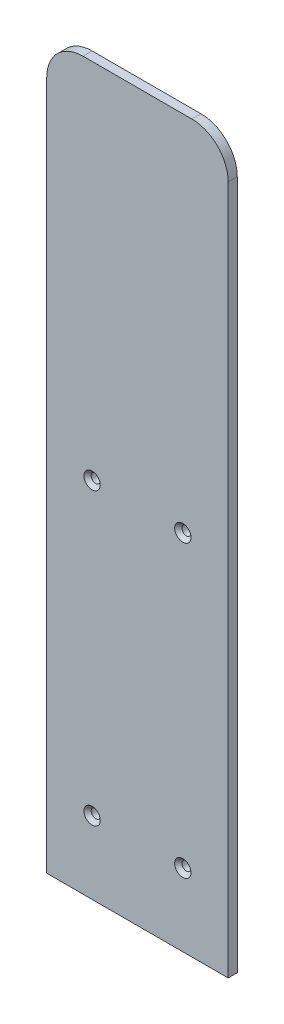
ISO-10303-21;
HEADER;
FILE_DESCRIPTION(('STEP AP214'),'2;1');
FILE_NAME('part.step','',(''),(''),'','','');
FILE_SCHEMA(('AUTOMOTIVE_DESIGN { 1 0 10303 214 1 1 1 1 }'));
ENDSEC;
DATA;
#1=APPLICATION_CONTEXT('core data for automotive mechanical design processes');
#2=APPLICATION_PROTOCOL_DEFINITION('international standard','automotive_design',2000,#1);
#3=PRODUCT_CONTEXT('',#1,'mechanical');
#4=PRODUCT('Part','Part','',(#3));
#5=PRODUCT_RELATED_PRODUCT_CATEGORY('part','',(#4));
#6=PRODUCT_DEFINITION_FORMATION('','',#4);
#7=PRODUCT_DEFINITION_CONTEXT('part definition',#1,'design');
#8=PRODUCT_DEFINITION('design','',#6,#7);
#9=PRODUCT_DEFINITION_SHAPE('','',#8);
#10=(LENGTH_UNIT() NAMED_UNIT(*) SI_UNIT(.MILLI.,.METRE.));
#11=(NAMED_UNIT(*) PLANE_ANGLE_UNIT() SI_UNIT($,.RADIAN.));
#12=(NAMED_UNIT(*) SI_UNIT($,.STERADIAN.) SOLID_ANGLE_UNIT());
#13=UNCERTAINTY_MEASURE_WITH_UNIT(LENGTH_MEASURE(1.E-05),#10,'distance_accuracy_value','');
#14=(GEOMETRIC_REPRESENTATION_CONTEXT(3) GLOBAL_UNCERTAINTY_ASSIGNED_CONTEXT((#13)) GLOBAL_UNIT_ASSIGNED_CONTEXT((#10,
#11,#12)) REPRESENTATION_CONTEXT('',''));
#15=CARTESIAN_POINT('',(0.,0.,0.));
#16=DIRECTION('',(0.,0.,1.));
#17=DIRECTION('',(1.,0.,0.));
#18=AXIS2_PLACEMENT_3D('',#15,#16,#17);
#19=CARTESIAN_POINT('',(31.75,127.,3.175));
#20=DIRECTION('',(-1.,0.,0.));
#21=DIRECTION('',(0.,-1.,0.));
#22=AXIS2_PLACEMENT_3D('',#19,#20,#21);
#23=PLANE('',#22);
#24=DIRECTION('',(0.,1.,0.));
#25=VECTOR('',#24,1.);
#26=CARTESIAN_POINT('',(31.75,127.,0.));
#27=LINE('',#26,#25);
#28=CARTESIAN_POINT('',(31.75,-127.,0.));
#29=VERTEX_POINT('',#28);
#30=CARTESIAN_POINT('',(31.75,114.3,0.));
#31=VERTEX_POINT('',#30);
#32=EDGE_CURVE('E111',#29,#31,#27,.T.);
#33=ORIENTED_EDGE('',*,*,#32,.T.);
#34=DIRECTION('',(0.,0.,-1.));
#35=VECTOR('',#34,1.);
#36=CARTESIAN_POINT('',(31.75,114.3,3.175));
#37=LINE('',#36,#35);
#38=CARTESIAN_POINT('',(31.75,114.3,3.175));
#39=VERTEX_POINT('',#38);
#40=EDGE_CURVE('E55',#31,#39,#37,.F.);
#41=ORIENTED_EDGE('',*,*,#40,.T.);
#42=DIRECTION('',(0.,1.,0.));
#43=VECTOR('',#42,1.);
#44=CARTESIAN_POINT('',(31.75,127.,3.175));
#45=LINE('',#44,#43);
#46=CARTESIAN_POINT('',(31.75,-127.,3.175));
#47=VERTEX_POINT('',#46);
#48=EDGE_CURVE('E119',#47,#39,#45,.T.);
#49=ORIENTED_EDGE('',*,*,#48,.F.);
#50=DIRECTION('',(0.,0.,-1.));
#51=VECTOR('',#50,1.);
#52=CARTESIAN_POINT('',(31.75,-127.,3.175));
#53=LINE('',#52,#51);
#54=EDGE_CURVE('E103',#47,#29,#53,.T.);
#55=ORIENTED_EDGE('',*,*,#54,.T.);
#56=EDGE_LOOP('',(#33,#41,#49,#55));
#57=FACE_BOUND('',#56,.T.);
#58=ADVANCED_FACE('F32',(#57),#23,.F.);
#59=CARTESIAN_POINT('',(-31.75,127.,3.175));
#60=DIRECTION('',(0.,-1.,0.));
#61=DIRECTION('',(0.,0.,-1.));
#62=AXIS2_PLACEMENT_3D('',#59,#60,#61);
#63=PLANE('',#62);
#64=DIRECTION('',(-1.,0.,0.));
#65=VECTOR('',#64,1.);
#66=CARTESIAN_POINT('',(-31.75,127.,3.175));
#67=LINE('',#66,#65);
#68=CARTESIAN_POINT('',(19.05,127.,3.175));
#69=VERTEX_POINT('',#68);
#70=CARTESIAN_POINT('',(-19.05,127.,3.175));
#71=VERTEX_POINT('',#70);
#72=EDGE_CURVE('E93',#69,#71,#67,.T.);
#73=ORIENTED_EDGE('',*,*,#72,.F.);
#74=DIRECTION('',(0.,0.,-1.));
#75=VECTOR('',#74,1.);
#76=CARTESIAN_POINT('',(19.05,127.,3.175));
#77=LINE('',#76,#75);
#78=CARTESIAN_POINT('',(19.05,127.,0.));
#79=VERTEX_POINT('',#78);
#80=EDGE_CURVE('E146',#69,#79,#77,.T.);
#81=ORIENTED_EDGE('',*,*,#80,.T.);
#82=DIRECTION('',(-1.,0.,0.));
#83=VECTOR('',#82,1.);
#84=CARTESIAN_POINT('',(-31.75,127.,0.));
#85=LINE('',#84,#83);
#86=CARTESIAN_POINT('',(-19.05,127.,0.));
#87=VERTEX_POINT('',#86);
#88=EDGE_CURVE('E113',#79,#87,#85,.T.);
#89=ORIENTED_EDGE('',*,*,#88,.T.);
#90=DIRECTION('',(0.,0.,-1.));
#91=VECTOR('',#90,1.);
#92=CARTESIAN_POINT('',(-19.05,127.,3.175));
#93=LINE('',#92,#91);
#94=EDGE_CURVE('E144',#87,#71,#93,.F.);
#95=ORIENTED_EDGE('',*,*,#94,.T.);
#96=EDGE_LOOP('',(#73,#81,#89,#95));
#97=FACE_BOUND('',#96,.T.);
#98=ADVANCED_FACE('F159',(#97),#63,.F.);
#99=CARTESIAN_POINT('',(-31.75,127.,3.175));
#100=DIRECTION('',(1.,0.,0.));
#101=DIRECTION('',(0.,1.,0.));
#102=AXIS2_PLACEMENT_3D('',#99,#100,#101);
#103=PLANE('',#102);
#104=DIRECTION('',(0.,-1.,0.));
#105=VECTOR('',#104,1.);
#106=CARTESIAN_POINT('',(-31.75,127.,3.175));
#107=LINE('',#106,#105);
#108=CARTESIAN_POINT('',(-31.75,114.3,3.175));
#109=VERTEX_POINT('',#108);
#110=CARTESIAN_POINT('',(-31.75,-127.,3.175));
#111=VERTEX_POINT('',#110);
#112=EDGE_CURVE('E85',#109,#111,#107,.T.);
#113=ORIENTED_EDGE('',*,*,#112,.F.);
#114=DIRECTION('',(0.,0.,-1.));
#115=VECTOR('',#114,1.);
#116=CARTESIAN_POINT('',(-31.75,114.3,3.175));
#117=LINE('',#116,#115);
#118=CARTESIAN_POINT('',(-31.75,114.3,0.));
#119=VERTEX_POINT('',#118);
#120=EDGE_CURVE('E11',#109,#119,#117,.T.);
#121=ORIENTED_EDGE('',*,*,#120,.T.);
#122=DIRECTION('',(0.,-1.,0.));
#123=VECTOR('',#122,1.);
#124=CARTESIAN_POINT('',(-31.75,127.,0.));
#125=LINE('',#124,#123);
#126=CARTESIAN_POINT('',(-31.75,-127.,0.));
#127=VERTEX_POINT('',#126);
#128=EDGE_CURVE('E99',#119,#127,#125,.T.);
#129=ORIENTED_EDGE('',*,*,#128,.T.);
#130=DIRECTION('',(0.,0.,-1.));
#131=VECTOR('',#130,1.);
#132=CARTESIAN_POINT('',(-31.75,-127.,3.175));
#133=LINE('',#132,#131);
#134=EDGE_CURVE('E96',#111,#127,#133,.T.);
#135=ORIENTED_EDGE('',*,*,#134,.F.);
#136=EDGE_LOOP('',(#113,#121,#129,#135));
#137=FACE_BOUND('',#136,.T.);
#138=ADVANCED_FACE('F97',(#137),#103,.F.);
#139=CARTESIAN_POINT('',(-31.75,-127.,3.175));
#140=DIRECTION('',(0.,1.,0.));
#141=DIRECTION('',(0.,0.,1.));
#142=AXIS2_PLACEMENT_3D('',#139,#140,#141);
#143=PLANE('',#142);
#144=DIRECTION('',(1.,0.,0.));
#145=VECTOR('',#144,1.);
#146=CARTESIAN_POINT('',(-31.75,-127.,0.));
#147=LINE('',#146,#145);
#148=EDGE_CURVE('E118',#127,#29,#147,.T.);
#149=ORIENTED_EDGE('',*,*,#148,.T.);
#150=ORIENTED_EDGE('',*,*,#54,.F.);
#151=DIRECTION('',(1.,0.,0.));
#152=VECTOR('',#151,1.);
#153=CARTESIAN_POINT('',(-31.75,-127.,3.175));
#154=LINE('',#153,#152);
#155=EDGE_CURVE('E89',#111,#47,#154,.T.);
#156=ORIENTED_EDGE('',*,*,#155,.F.);
#157=ORIENTED_EDGE('',*,*,#134,.T.);
#158=EDGE_LOOP('',(#149,#150,#156,#157));
#159=FACE_BOUND('',#158,.T.);
#160=ADVANCED_FACE('F105',(#159),#143,.F.);
#161=CARTESIAN_POINT('',(0.,0.,3.175));
#162=DIRECTION('',(0.,0.,1.));
#163=DIRECTION('',(1.,0.,0.));
#164=AXIS2_PLACEMENT_3D('',#161,#162,#163);
#165=PLANE('',#164);
#166=CARTESIAN_POINT('',(-15.875,-101.6,3.175));
#167=DIRECTION('',(0.,0.,1.));
#168=DIRECTION('',(1.,0.,0.));
#169=AXIS2_PLACEMENT_3D('',#166,#167,#168);
#170=CIRCLE('',#169,2.85750000000004);
#171=CARTESIAN_POINT('',(-13.0174999999999,-101.6,3.175));
#172=VERTEX_POINT('',#171);
#173=EDGE_CURVE('E132',#172,#172,#170,.F.);
#174=ORIENTED_EDGE('',*,*,#173,.T.);
#175=EDGE_LOOP('',(#174));
#176=FACE_BOUND('',#175,.T.);
#177=CARTESIAN_POINT('',(15.875,-101.6,3.175));
#178=DIRECTION('',(0.,0.,1.));
#179=DIRECTION('',(1.,0.,0.));
#180=AXIS2_PLACEMENT_3D('',#177,#178,#179);
#181=CIRCLE('',#180,2.85750000000004);
#182=CARTESIAN_POINT('',(18.7325000000001,-101.6,3.175));
#183=VERTEX_POINT('',#182);
#184=EDGE_CURVE('E129',#183,#183,#181,.F.);
#185=ORIENTED_EDGE('',*,*,#184,.T.);
#186=EDGE_LOOP('',(#185));
#187=FACE_BOUND('',#186,.T.);
#188=CARTESIAN_POINT('',(-15.875,0.,3.175));
#189=DIRECTION('',(0.,0.,1.));
#190=DIRECTION('',(1.,0.,0.));
#191=AXIS2_PLACEMENT_3D('',#188,#189,#190);
#192=CIRCLE('',#191,2.85750000000004);
#193=CARTESIAN_POINT('',(-13.0175,0.,3.175));
#194=VERTEX_POINT('',#193);
#195=EDGE_CURVE('E126',#194,#194,#192,.F.);
#196=ORIENTED_EDGE('',*,*,#195,.T.);
#197=EDGE_LOOP('',(#196));
#198=FACE_BOUND('',#197,.T.);
#199=CARTESIAN_POINT('',(15.875,0.,3.175));
#200=DIRECTION('',(0.,0.,1.));
#201=DIRECTION('',(1.,0.,0.));
#202=AXIS2_PLACEMENT_3D('',#199,#200,#201);
#203=CIRCLE('',#202,2.85750000000004);
#204=CARTESIAN_POINT('',(18.7325,0.,3.175));
#205=VERTEX_POINT('',#204);
#206=EDGE_CURVE('E123',#205,#205,#203,.F.);
#207=ORIENTED_EDGE('',*,*,#206,.T.);
#208=EDGE_LOOP('',(#207));
#209=FACE_BOUND('',#208,.T.);
#210=ORIENTED_EDGE('',*,*,#48,.T.);
#211=CARTESIAN_POINT('',(19.05,114.3,3.175));
#212=DIRECTION('',(0.,0.,1.));
#213=DIRECTION('',(1.,0.,0.));
#214=AXIS2_PLACEMENT_3D('',#211,#212,#213);
#215=CIRCLE('',#214,12.7);
#216=EDGE_CURVE('E40',#39,#69,#215,.T.);
#217=ORIENTED_EDGE('',*,*,#216,.T.);
#218=ORIENTED_EDGE('',*,*,#72,.T.);
#219=CARTESIAN_POINT('',(-19.05,114.3,3.175));
#220=DIRECTION('',(0.,0.,1.));
#221=DIRECTION('',(1.,0.,0.));
#222=AXIS2_PLACEMENT_3D('',#219,#220,#221);
#223=CIRCLE('',#222,12.7);
#224=EDGE_CURVE('E47',#71,#109,#223,.T.);
#225=ORIENTED_EDGE('',*,*,#224,.T.);
#226=ORIENTED_EDGE('',*,*,#112,.T.);
#227=ORIENTED_EDGE('',*,*,#155,.T.);
#228=EDGE_LOOP('',(#210,#217,#218,#225,#226,#227));
#229=FACE_BOUND('',#228,.T.);
#230=ADVANCED_FACE('F87',(#176,#187,#198,#209,#229),#165,.T.);
#231=CARTESIAN_POINT('',(0.,0.,0.));
#232=DIRECTION('',(0.,0.,1.));
#233=DIRECTION('',(1.,0.,0.));
#234=AXIS2_PLACEMENT_3D('',#231,#232,#233);
#235=PLANE('',#234);
#236=CARTESIAN_POINT('',(-15.875,-101.6,0.));
#237=DIRECTION('',(0.,0.,1.));
#238=DIRECTION('',(1.,0.,0.));
#239=AXIS2_PLACEMENT_3D('',#236,#237,#238);
#240=CIRCLE('',#239,1.5875);
#241=CARTESIAN_POINT('',(-14.2875,-101.6,0.));
#242=VERTEX_POINT('',#241);
#243=EDGE_CURVE('E170',#242,#242,#240,.F.);
#244=ORIENTED_EDGE('',*,*,#243,.F.);
#245=EDGE_LOOP('',(#244));
#246=FACE_BOUND('',#245,.T.);
#247=CARTESIAN_POINT('',(15.875,0.,0.));
#248=DIRECTION('',(0.,0.,1.));
#249=DIRECTION('',(1.,0.,0.));
#250=AXIS2_PLACEMENT_3D('',#247,#248,#249);
#251=CIRCLE('',#250,1.5875);
#252=CARTESIAN_POINT('',(17.4625,0.,0.));
#253=VERTEX_POINT('',#252);
#254=EDGE_CURVE('E174',#253,#253,#251,.F.);
#255=ORIENTED_EDGE('',*,*,#254,.F.);
#256=EDGE_LOOP('',(#255));
#257=FACE_BOUND('',#256,.T.);
#258=CARTESIAN_POINT('',(-15.875,0.,0.));
#259=DIRECTION('',(0.,0.,1.));
#260=DIRECTION('',(1.,0.,0.));
#261=AXIS2_PLACEMENT_3D('',#258,#259,#260);
#262=CIRCLE('',#261,1.5875);
#263=CARTESIAN_POINT('',(-14.2875,0.,0.));
#264=VERTEX_POINT('',#263);
#265=EDGE_CURVE('E171',#264,#264,#262,.F.);
#266=ORIENTED_EDGE('',*,*,#265,.F.);
#267=EDGE_LOOP('',(#266));
#268=FACE_BOUND('',#267,.T.);
#269=CARTESIAN_POINT('',(15.875,-101.6,0.));
#270=DIRECTION('',(0.,0.,1.));
#271=DIRECTION('',(1.,0.,0.));
#272=AXIS2_PLACEMENT_3D('',#269,#270,#271);
#273=CIRCLE('',#272,1.5875);
#274=CARTESIAN_POINT('',(17.4625,-101.6,0.));
#275=VERTEX_POINT('',#274);
#276=EDGE_CURVE('E114',#275,#275,#273,.F.);
#277=ORIENTED_EDGE('',*,*,#276,.F.);
#278=EDGE_LOOP('',(#277));
#279=FACE_BOUND('',#278,.T.);
#280=ORIENTED_EDGE('',*,*,#88,.F.);
#281=CARTESIAN_POINT('',(19.05,114.3,0.));
#282=DIRECTION('',(0.,0.,1.));
#283=DIRECTION('',(1.,0.,0.));
#284=AXIS2_PLACEMENT_3D('',#281,#282,#283);
#285=CIRCLE('',#284,12.7);
#286=EDGE_CURVE('E151',#79,#31,#285,.F.);
#287=ORIENTED_EDGE('',*,*,#286,.T.);
#288=ORIENTED_EDGE('',*,*,#32,.F.);
#289=ORIENTED_EDGE('',*,*,#148,.F.);
#290=ORIENTED_EDGE('',*,*,#128,.F.);
#291=CARTESIAN_POINT('',(-19.05,114.3,0.));
#292=DIRECTION('',(0.,0.,1.));
#293=DIRECTION('',(1.,0.,0.));
#294=AXIS2_PLACEMENT_3D('',#291,#292,#293);
#295=CIRCLE('',#294,12.7);
#296=EDGE_CURVE('E149',#119,#87,#295,.F.);
#297=ORIENTED_EDGE('',*,*,#296,.T.);
#298=EDGE_LOOP('',(#280,#287,#288,#289,#290,#297));
#299=FACE_BOUND('',#298,.T.);
#300=ADVANCED_FACE('F165',(#246,#257,#268,#279,#299),#235,.F.);
#301=CARTESIAN_POINT('',(15.875,-101.6,-0.00100000000000013));
#302=DIRECTION('',(0.,0.,1.));
#303=DIRECTION('',(1.,0.,0.));
#304=AXIS2_PLACEMENT_3D('',#301,#302,#303);
#305=CYLINDRICAL_SURFACE('',#304,1.5875);
#306=CARTESIAN_POINT('',(15.875,-101.6,1.90499999999995));
#307=DIRECTION('',(0.,0.,1.));
#308=DIRECTION('',(1.,0.,0.));
#309=AXIS2_PLACEMENT_3D('',#306,#307,#308);
#310=CIRCLE('',#309,1.5875);
#311=CARTESIAN_POINT('',(17.4625,-101.6,1.90499999999995));
#312=VERTEX_POINT('',#311);
#313=EDGE_CURVE('E135',#312,#312,#310,.T.);
#314=ORIENTED_EDGE('',*,*,#313,.T.);
#315=EDGE_LOOP('',(#314));
#316=FACE_BOUND('',#315,.T.);
#317=ORIENTED_EDGE('',*,*,#276,.T.);
#318=EDGE_LOOP('',(#317));
#319=FACE_BOUND('',#318,.T.);
#320=ADVANCED_FACE('F184',(#316,#319),#305,.F.);
#321=CARTESIAN_POINT('',(-15.875,0.,-0.00100000000000013));
#322=DIRECTION('',(0.,0.,1.));
#323=DIRECTION('',(1.,0.,0.));
#324=AXIS2_PLACEMENT_3D('',#321,#322,#323);
#325=CYLINDRICAL_SURFACE('',#324,1.5875);
#326=CARTESIAN_POINT('',(-15.875,0.,1.90499999999996));
#327=DIRECTION('',(0.,0.,1.));
#328=DIRECTION('',(1.,0.,0.));
#329=AXIS2_PLACEMENT_3D('',#326,#327,#328);
#330=CIRCLE('',#329,1.5875);
#331=CARTESIAN_POINT('',(-14.2875,0.,1.90499999999996));
#332=VERTEX_POINT('',#331);
#333=EDGE_CURVE('E138',#332,#332,#330,.T.);
#334=ORIENTED_EDGE('',*,*,#333,.T.);
#335=EDGE_LOOP('',(#334));
#336=FACE_BOUND('',#335,.T.);
#337=ORIENTED_EDGE('',*,*,#265,.T.);
#338=EDGE_LOOP('',(#337));
#339=FACE_BOUND('',#338,.T.);
#340=ADVANCED_FACE('F193',(#336,#339),#325,.F.);
#341=CARTESIAN_POINT('',(15.875,0.,-0.00100000000000013));
#342=DIRECTION('',(0.,0.,1.));
#343=DIRECTION('',(1.,0.,0.));
#344=AXIS2_PLACEMENT_3D('',#341,#342,#343);
#345=CYLINDRICAL_SURFACE('',#344,1.5875);
#346=CARTESIAN_POINT('',(15.875,0.,1.90499999999995));
#347=DIRECTION('',(0.,0.,1.));
#348=DIRECTION('',(1.,0.,0.));
#349=AXIS2_PLACEMENT_3D('',#346,#347,#348);
#350=CIRCLE('',#349,1.5875);
#351=CARTESIAN_POINT('',(17.4625,0.,1.90499999999995));
#352=VERTEX_POINT('',#351);
#353=EDGE_CURVE('E141',#352,#352,#350,.T.);
#354=ORIENTED_EDGE('',*,*,#353,.T.);
#355=EDGE_LOOP('',(#354));
#356=FACE_BOUND('',#355,.T.);
#357=ORIENTED_EDGE('',*,*,#254,.T.);
#358=EDGE_LOOP('',(#357));
#359=FACE_BOUND('',#358,.T.);
#360=ADVANCED_FACE('F199',(#356,#359),#345,.F.);
#361=CARTESIAN_POINT('',(-15.875,-101.6,-0.00100000000000013));
#362=DIRECTION('',(0.,0.,1.));
#363=DIRECTION('',(1.,0.,0.));
#364=AXIS2_PLACEMENT_3D('',#361,#362,#363);
#365=CYLINDRICAL_SURFACE('',#364,1.5875);
#366=CARTESIAN_POINT('',(-15.875,-101.6,1.90499999999995));
#367=DIRECTION('',(0.,0.,1.));
#368=DIRECTION('',(1.,0.,0.));
#369=AXIS2_PLACEMENT_3D('',#366,#367,#368);
#370=CIRCLE('',#369,1.5875);
#371=CARTESIAN_POINT('',(-14.2875,-101.6,1.90499999999995));
#372=VERTEX_POINT('',#371);
#373=EDGE_CURVE('E102',#372,#372,#370,.T.);
#374=ORIENTED_EDGE('',*,*,#373,.T.);
#375=EDGE_LOOP('',(#374));
#376=FACE_BOUND('',#375,.T.);
#377=ORIENTED_EDGE('',*,*,#243,.T.);
#378=EDGE_LOOP('',(#377));
#379=FACE_BOUND('',#378,.T.);
#380=ADVANCED_FACE('F180',(#376,#379),#365,.F.);
#381=CARTESIAN_POINT('',(-15.875,-101.6,1.90499999999995));
#382=DIRECTION('',(0.,0.,1.));
#383=DIRECTION('',(1.,0.,0.));
#384=AXIS2_PLACEMENT_3D('',#381,#382,#383);
#385=CONICAL_SURFACE('',#384,1.5875,0.785398163397446);
#386=CARTESIAN_POINT('',(-13.0174999999999,-101.6,3.175));
#387=CARTESIAN_POINT('',(-13.0307291666666,-101.6,3.16177083333333));
#388=CARTESIAN_POINT('',(-13.0439583333333,-101.6,3.14854166666667));
#389=CARTESIAN_POINT('',(-13.0704166666666,-101.6,3.12208333333333));
#390=CARTESIAN_POINT('',(-13.0836458333333,-101.6,3.10885416666666));
#391=CARTESIAN_POINT('',(-13.1101041666666,-101.6,3.08239583333333));
#392=CARTESIAN_POINT('',(-13.1233333333333,-101.6,3.06916666666666));
#393=CARTESIAN_POINT('',(-13.1497916666666,-101.6,3.04270833333333));
#394=CARTESIAN_POINT('',(-13.1630208333333,-101.6,3.02947916666666));
#395=CARTESIAN_POINT('',(-13.1894791666666,-101.6,3.00302083333333));
#396=CARTESIAN_POINT('',(-13.2027083333333,-101.6,2.98979166666666));
#397=CARTESIAN_POINT('',(-13.2291666666666,-101.6,2.96333333333332));
#398=CARTESIAN_POINT('',(-13.2423958333333,-101.6,2.95010416666666));
#399=CARTESIAN_POINT('',(-13.2688541666666,-101.6,2.92364583333332));
#400=CARTESIAN_POINT('',(-13.2820833333333,-101.6,2.91041666666666));
#401=CARTESIAN_POINT('',(-13.3085416666666,-101.6,2.88395833333332));
#402=CARTESIAN_POINT('',(-13.3217708333333,-101.6,2.87072916666665));
#403=CARTESIAN_POINT('',(-13.3482291666666,-101.6,2.84427083333332));
#404=CARTESIAN_POINT('',(-13.3614583333333,-101.6,2.83104166666665));
#405=CARTESIAN_POINT('',(-13.3879166666666,-101.6,2.80458333333332));
#406=CARTESIAN_POINT('',(-13.4011458333333,-101.6,2.79135416666665));
#407=CARTESIAN_POINT('',(-13.4276041666666,-101.6,2.76489583333332));
#408=CARTESIAN_POINT('',(-13.4408333333333,-101.6,2.75166666666665));
#409=CARTESIAN_POINT('',(-13.4672916666666,-101.6,2.72520833333332));
#410=CARTESIAN_POINT('',(-13.4805208333333,-101.6,2.71197916666665));
#411=CARTESIAN_POINT('',(-13.5069791666666,-101.6,2.68552083333331));
#412=CARTESIAN_POINT('',(-13.5202083333333,-101.6,2.67229166666665));
#413=CARTESIAN_POINT('',(-13.5466666666666,-101.6,2.64583333333331));
#414=CARTESIAN_POINT('',(-13.5598958333333,-101.6,2.63260416666665));
#415=CARTESIAN_POINT('',(-13.5863541666666,-101.6,2.60614583333331));
#416=CARTESIAN_POINT('',(-13.5995833333333,-101.6,2.59291666666664));
#417=CARTESIAN_POINT('',(-13.6260416666666,-101.6,2.56645833333331));
#418=CARTESIAN_POINT('',(-13.6392708333333,-101.6,2.55322916666664));
#419=CARTESIAN_POINT('',(-13.6657291666666,-101.6,2.52677083333331));
#420=CARTESIAN_POINT('',(-13.6789583333333,-101.6,2.51354166666664));
#421=CARTESIAN_POINT('',(-13.7054166666666,-101.6,2.48708333333331));
#422=CARTESIAN_POINT('',(-13.7186458333333,-101.6,2.47385416666664));
#423=CARTESIAN_POINT('',(-13.7451041666666,-101.6,2.44739583333331));
#424=CARTESIAN_POINT('',(-13.7583333333333,-101.6,2.43416666666664));
#425=CARTESIAN_POINT('',(-13.7847916666666,-101.6,2.4077083333333));
#426=CARTESIAN_POINT('',(-13.7980208333333,-101.6,2.39447916666664));
#427=CARTESIAN_POINT('',(-13.8244791666666,-101.6,2.3680208333333));
#428=CARTESIAN_POINT('',(-13.8377083333333,-101.6,2.35479166666664));
#429=CARTESIAN_POINT('',(-13.8641666666666,-101.6,2.3283333333333));
#430=CARTESIAN_POINT('',(-13.8773958333333,-101.6,2.31510416666663));
#431=CARTESIAN_POINT('',(-13.9038541666666,-101.6,2.2886458333333));
#432=CARTESIAN_POINT('',(-13.9170833333333,-101.6,2.27541666666663));
#433=CARTESIAN_POINT('',(-13.9435416666666,-101.6,2.2489583333333));
#434=CARTESIAN_POINT('',(-13.9567708333333,-101.6,2.23572916666663));
#435=CARTESIAN_POINT('',(-13.9832291666666,-101.6,2.2092708333333));
#436=CARTESIAN_POINT('',(-13.9964583333333,-101.6,2.19604166666663));
#437=CARTESIAN_POINT('',(-14.0229166666666,-101.6,2.1695833333333));
#438=CARTESIAN_POINT('',(-14.0361458333333,-101.6,2.15635416666663));
#439=CARTESIAN_POINT('',(-14.0626041666667,-101.6,2.12989583333329));
#440=CARTESIAN_POINT('',(-14.0758333333333,-101.6,2.11666666666663));
#441=CARTESIAN_POINT('',(-14.1022916666667,-101.6,2.09020833333329));
#442=CARTESIAN_POINT('',(-14.1155208333333,-101.6,2.07697916666663));
#443=CARTESIAN_POINT('',(-14.1419791666667,-101.6,2.05052083333329));
#444=CARTESIAN_POINT('',(-14.1552083333333,-101.6,2.03729166666662));
#445=CARTESIAN_POINT('',(-14.1816666666667,-101.6,2.01083333333329));
#446=CARTESIAN_POINT('',(-14.1948958333333,-101.6,1.99760416666662));
#447=CARTESIAN_POINT('',(-14.2213541666667,-101.6,1.97114583333329));
#448=CARTESIAN_POINT('',(-14.2345833333333,-101.6,1.95791666666662));
#449=CARTESIAN_POINT('',(-14.2610416666667,-101.6,1.93145833333329));
#450=CARTESIAN_POINT('',(-14.2742708333333,-101.6,1.91822916666662));
#451=CARTESIAN_POINT('',(-14.2875,-101.6,1.90499999999995));
#452=B_SPLINE_CURVE_WITH_KNOTS('',3,(#386,#387,#388,#389,#390,#391,#392,#393,#394,#395,#396,
#397,#398,#399,#400,#401,#402,#403,#404,#405,#406,#407,#408,#409,#410,#411,#412,#413,#414,#415,
#416,#417,#418,#419,#420,#421,#422,#423,#424,#425,#426,#427,#428,#429,#430,#431,#432,#433,#434,
#435,#436,#437,#438,#439,#440,#441,#442,#443,#444,#445,#446,#447,#448,#449,#450,#451),
.UNSPECIFIED.,.F.,.F.,(4,2,2,2,2,2,2,2,2,2,2,2,2,2,2,2,2,2,2,2,2,2,2,2,2,2,2,2,2,2,2,2,4),(0.,
0.0561266007566844,0.112253201513369,0.168379802270053,0.224506403026737,0.280633003783421,
0.336759604540105,0.392886205296789,0.449012806053474,0.505139406810158,0.561266007566842,
0.617392608323526,0.67351920908021,0.729645809836895,0.785772410593578,0.841899011350263,
0.898025612106947,0.954152212863631,1.01027881362032,1.066405414377,1.12253201513368,
1.17865861589037,1.23478521664705,1.29091181740374,1.34703841816042,1.4031650189171,
1.45929161967379,1.51541822043047,1.57154482118716,1.62767142194384,1.68379802270052,
1.73992462345721,1.79605122421389),.UNSPECIFIED.);
#453=EDGE_CURVE('BSEAM211',#172,#372,#452,.T.);
#454=ORIENTED_EDGE('',*,*,#173,.F.);
#455=ORIENTED_EDGE('',*,*,#373,.F.);
#456=ORIENTED_EDGE('',*,*,#453,.T.);
#457=ORIENTED_EDGE('',*,*,#453,.F.);
#458=EDGE_LOOP('',(#454,#456,#455,#457));
#459=FACE_BOUND('',#458,.T.);
#460=ADVANCED_FACE('F211',(#459),#385,.F.);
#461=CARTESIAN_POINT('',(15.875,-101.6,1.90499999999995));
#462=DIRECTION('',(0.,0.,1.));
#463=DIRECTION('',(1.,0.,0.));
#464=AXIS2_PLACEMENT_3D('',#461,#462,#463);
#465=CONICAL_SURFACE('',#464,1.5875,0.785398163397446);
#466=CARTESIAN_POINT('',(18.7325000000001,-101.6,3.175));
#467=CARTESIAN_POINT('',(18.7192708333334,-101.6,3.16177083333333));
#468=CARTESIAN_POINT('',(18.7060416666667,-101.6,3.14854166666666));
#469=CARTESIAN_POINT('',(18.6795833333334,-101.6,3.12208333333333));
#470=CARTESIAN_POINT('',(18.6663541666667,-101.6,3.10885416666666));
#471=CARTESIAN_POINT('',(18.6398958333334,-101.6,3.08239583333333));
#472=CARTESIAN_POINT('',(18.6266666666667,-101.6,3.06916666666666));
#473=CARTESIAN_POINT('',(18.6002083333334,-101.6,3.04270833333333));
#474=CARTESIAN_POINT('',(18.5869791666667,-101.6,3.02947916666666));
#475=CARTESIAN_POINT('',(18.5605208333334,-101.6,3.00302083333333));
#476=CARTESIAN_POINT('',(18.5472916666667,-101.6,2.98979166666666));
#477=CARTESIAN_POINT('',(18.5208333333334,-101.6,2.96333333333332));
#478=CARTESIAN_POINT('',(18.5076041666667,-101.6,2.95010416666666));
#479=CARTESIAN_POINT('',(18.4811458333334,-101.6,2.92364583333332));
#480=CARTESIAN_POINT('',(18.4679166666667,-101.6,2.91041666666666));
#481=CARTESIAN_POINT('',(18.4414583333334,-101.6,2.88395833333332));
#482=CARTESIAN_POINT('',(18.4282291666667,-101.6,2.87072916666665));
#483=CARTESIAN_POINT('',(18.4017708333334,-101.6,2.84427083333332));
#484=CARTESIAN_POINT('',(18.3885416666667,-101.6,2.83104166666665));
#485=CARTESIAN_POINT('',(18.3620833333334,-101.6,2.80458333333332));
#486=CARTESIAN_POINT('',(18.3488541666667,-101.6,2.79135416666665));
#487=CARTESIAN_POINT('',(18.3223958333334,-101.6,2.76489583333332));
#488=CARTESIAN_POINT('',(18.3091666666667,-101.6,2.75166666666665));
#489=CARTESIAN_POINT('',(18.2827083333334,-101.6,2.72520833333332));
#490=CARTESIAN_POINT('',(18.2694791666667,-101.6,2.71197916666665));
#491=CARTESIAN_POINT('',(18.2430208333334,-101.6,2.68552083333331));
#492=CARTESIAN_POINT('',(18.2297916666667,-101.6,2.67229166666665));
#493=CARTESIAN_POINT('',(18.2033333333334,-101.6,2.64583333333331));
#494=CARTESIAN_POINT('',(18.1901041666667,-101.6,2.63260416666665));
#495=CARTESIAN_POINT('',(18.1636458333334,-101.6,2.60614583333331));
#496=CARTESIAN_POINT('',(18.1504166666667,-101.6,2.59291666666664));
#497=CARTESIAN_POINT('',(18.1239583333334,-101.6,2.56645833333331));
#498=CARTESIAN_POINT('',(18.1107291666667,-101.6,2.55322916666664));
#499=CARTESIAN_POINT('',(18.0842708333334,-101.6,2.52677083333331));
#500=CARTESIAN_POINT('',(18.0710416666667,-101.6,2.51354166666664));
#501=CARTESIAN_POINT('',(18.0445833333334,-101.6,2.48708333333331));
#502=CARTESIAN_POINT('',(18.0313541666667,-101.6,2.47385416666664));
#503=CARTESIAN_POINT('',(18.0048958333334,-101.6,2.44739583333331));
#504=CARTESIAN_POINT('',(17.9916666666667,-101.6,2.43416666666664));
#505=CARTESIAN_POINT('',(17.9652083333334,-101.6,2.4077083333333));
#506=CARTESIAN_POINT('',(17.9519791666667,-101.6,2.39447916666664));
#507=CARTESIAN_POINT('',(17.9255208333334,-101.6,2.3680208333333));
#508=CARTESIAN_POINT('',(17.9122916666667,-101.6,2.35479166666664));
#509=CARTESIAN_POINT('',(17.8858333333334,-101.6,2.3283333333333));
#510=CARTESIAN_POINT('',(17.8726041666667,-101.6,2.31510416666663));
#511=CARTESIAN_POINT('',(17.8461458333334,-101.6,2.2886458333333));
#512=CARTESIAN_POINT('',(17.8329166666667,-101.6,2.27541666666663));
#513=CARTESIAN_POINT('',(17.8064583333334,-101.6,2.2489583333333));
#514=CARTESIAN_POINT('',(17.7932291666667,-101.6,2.23572916666663));
#515=CARTESIAN_POINT('',(17.7667708333334,-101.6,2.2092708333333));
#516=CARTESIAN_POINT('',(17.7535416666667,-101.6,2.19604166666663));
#517=CARTESIAN_POINT('',(17.7270833333334,-101.6,2.1695833333333));
#518=CARTESIAN_POINT('',(17.7138541666667,-101.6,2.15635416666663));
#519=CARTESIAN_POINT('',(17.6873958333334,-101.6,2.12989583333329));
#520=CARTESIAN_POINT('',(17.6741666666667,-101.6,2.11666666666663));
#521=CARTESIAN_POINT('',(17.6477083333333,-101.6,2.09020833333329));
#522=CARTESIAN_POINT('',(17.6344791666667,-101.6,2.07697916666663));
#523=CARTESIAN_POINT('',(17.6080208333333,-101.6,2.05052083333329));
#524=CARTESIAN_POINT('',(17.5947916666667,-101.6,2.03729166666662));
#525=CARTESIAN_POINT('',(17.5683333333333,-101.6,2.01083333333329));
#526=CARTESIAN_POINT('',(17.5551041666667,-101.6,1.99760416666662));
#527=CARTESIAN_POINT('',(17.5286458333333,-101.6,1.97114583333329));
#528=CARTESIAN_POINT('',(17.5154166666667,-101.6,1.95791666666662));
#529=CARTESIAN_POINT('',(17.4889583333333,-101.6,1.93145833333329));
#530=CARTESIAN_POINT('',(17.4757291666667,-101.6,1.91822916666662));
#531=CARTESIAN_POINT('',(17.4625,-101.6,1.90499999999995));
#532=B_SPLINE_CURVE_WITH_KNOTS('',3,(#466,#467,#468,#469,#470,#471,#472,#473,#474,#475,#476,
#477,#478,#479,#480,#481,#482,#483,#484,#485,#486,#487,#488,#489,#490,#491,#492,#493,#494,#495,
#496,#497,#498,#499,#500,#501,#502,#503,#504,#505,#506,#507,#508,#509,#510,#511,#512,#513,#514,
#515,#516,#517,#518,#519,#520,#521,#522,#523,#524,#525,#526,#527,#528,#529,#530,#531),
.UNSPECIFIED.,.F.,.F.,(4,2,2,2,2,2,2,2,2,2,2,2,2,2,2,2,2,2,2,2,2,2,2,2,2,2,2,2,2,2,2,2,4),(0.,
0.0561266007566831,0.112253201513369,0.168379802270052,0.224506403026737,0.280633003783421,
0.336759604540106,0.392886205296789,0.449012806053473,0.505139406810158,0.561266007566841,
0.617392608323527,0.67351920908021,0.729645809836895,0.785772410593578,0.841899011350264,
0.898025612106947,0.954152212863633,1.01027881362032,1.066405414377,1.12253201513368,
1.17865861589037,1.23478521664705,1.29091181740374,1.34703841816042,1.4031650189171,
1.45929161967379,1.51541822043047,1.57154482118716,1.62767142194384,1.68379802270053,
1.73992462345721,1.79605122421389),.UNSPECIFIED.);
#533=EDGE_CURVE('BSEAM214',#183,#312,#532,.T.);
#534=ORIENTED_EDGE('',*,*,#184,.F.);
#535=ORIENTED_EDGE('',*,*,#313,.F.);
#536=ORIENTED_EDGE('',*,*,#533,.T.);
#537=ORIENTED_EDGE('',*,*,#533,.F.);
#538=EDGE_LOOP('',(#534,#536,#535,#537));
#539=FACE_BOUND('',#538,.T.);
#540=ADVANCED_FACE('F214',(#539),#465,.F.);
#541=CARTESIAN_POINT('',(-15.875,0.,1.90499999999996));
#542=DIRECTION('',(0.,0.,1.));
#543=DIRECTION('',(1.,0.,0.));
#544=AXIS2_PLACEMENT_3D('',#541,#542,#543);
#545=CONICAL_SURFACE('',#544,1.5875,0.785398163397446);
#546=ORIENTED_EDGE('',*,*,#195,.F.);
#547=EDGE_LOOP('',(#546));
#548=FACE_BOUND('',#547,.T.);
#549=ORIENTED_EDGE('',*,*,#333,.F.);
#550=EDGE_LOOP('',(#549));
#551=FACE_BOUND('',#550,.T.);
#552=ADVANCED_FACE('F218',(#548,#551),#545,.F.);
#553=CARTESIAN_POINT('',(15.875,0.,1.90499999999995));
#554=DIRECTION('',(0.,0.,1.));
#555=DIRECTION('',(1.,0.,0.));
#556=AXIS2_PLACEMENT_3D('',#553,#554,#555);
#557=CONICAL_SURFACE('',#556,1.5875,0.785398163397446);
#558=ORIENTED_EDGE('',*,*,#206,.F.);
#559=EDGE_LOOP('',(#558));
#560=FACE_BOUND('',#559,.T.);
#561=ORIENTED_EDGE('',*,*,#353,.F.);
#562=EDGE_LOOP('',(#561));
#563=FACE_BOUND('',#562,.T.);
#564=ADVANCED_FACE('F222',(#560,#563),#557,.F.);
#565=CARTESIAN_POINT('',(19.05,114.3,3.175));
#566=DIRECTION('',(0.,0.,-1.));
#567=DIRECTION('',(-1.,0.,0.));
#568=AXIS2_PLACEMENT_3D('',#565,#566,#567);
#569=CYLINDRICAL_SURFACE('',#568,12.7);
#570=ORIENTED_EDGE('',*,*,#216,.F.);
#571=ORIENTED_EDGE('',*,*,#40,.F.);
#572=ORIENTED_EDGE('',*,*,#286,.F.);
#573=ORIENTED_EDGE('',*,*,#80,.F.);
#574=EDGE_LOOP('',(#570,#571,#572,#573));
#575=FACE_BOUND('',#574,.T.);
#576=ADVANCED_FACE('F162',(#575),#569,.T.);
#577=CARTESIAN_POINT('',(-19.05,114.3,3.175));
#578=DIRECTION('',(0.,0.,-1.));
#579=DIRECTION('',(-1.,0.,0.));
#580=AXIS2_PLACEMENT_3D('',#577,#578,#579);
#581=CYLINDRICAL_SURFACE('',#580,12.7);
#582=ORIENTED_EDGE('',*,*,#224,.F.);
#583=ORIENTED_EDGE('',*,*,#94,.F.);
#584=ORIENTED_EDGE('',*,*,#296,.F.);
#585=ORIENTED_EDGE('',*,*,#120,.F.);
#586=EDGE_LOOP('',(#582,#583,#584,#585));
#587=FACE_BOUND('',#586,.T.);
#588=ADVANCED_FACE('F34',(#587),#581,.T.);
#589=CLOSED_SHELL('',(#58,#98,#138,#160,#230,#300,#320,#340,#360,#380,#460,#540,#552,#564,#576,#588));
#590=MANIFOLD_SOLID_BREP('B2',#589);
#591=ADVANCED_BREP_SHAPE_REPRESENTATION('',(#18,#590),#14);
#592=SHAPE_DEFINITION_REPRESENTATION(#9,#591);
ENDSEC;
END-ISO-10303-21;
